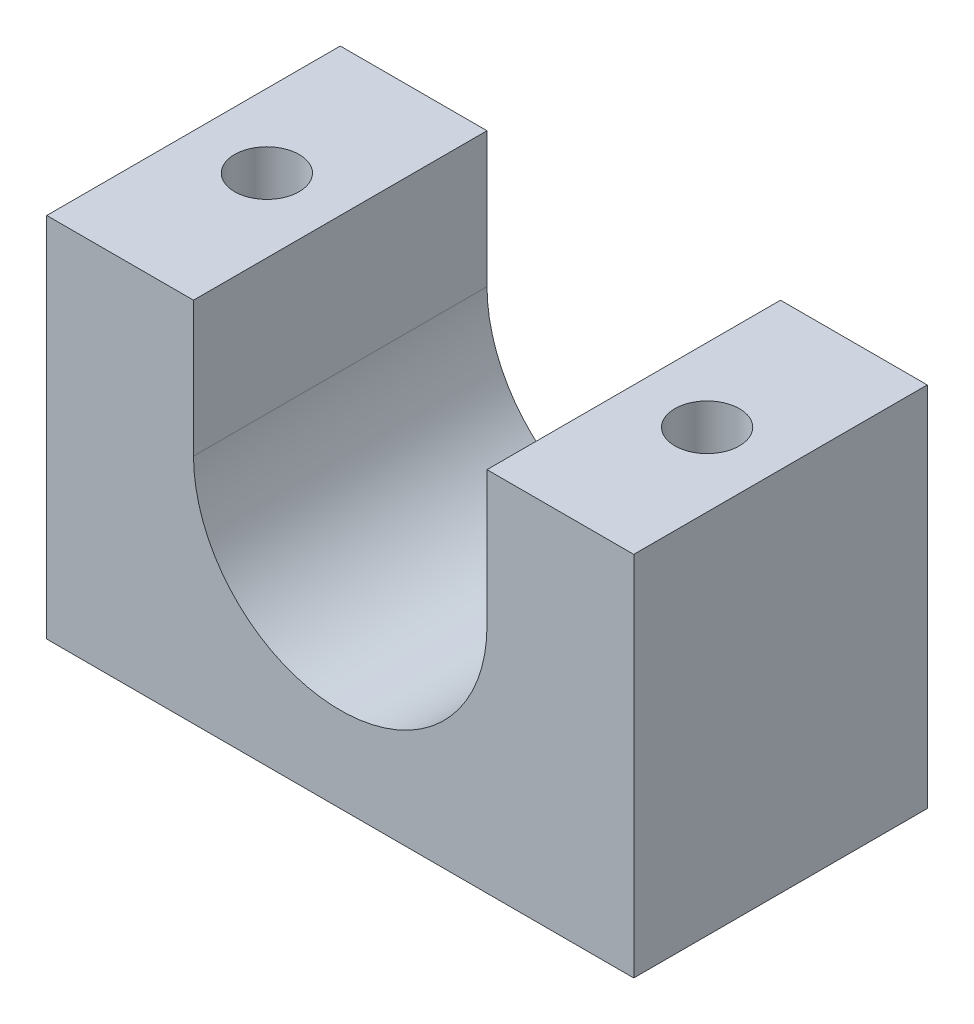
ISO-10303-21;
HEADER;
FILE_DESCRIPTION(('STEP AP214'),'2;1');
FILE_NAME('part.step','',(''),(''),'','','');
FILE_SCHEMA(('AUTOMOTIVE_DESIGN { 1 0 10303 214 1 1 1 1 }'));
ENDSEC;
DATA;
#1=APPLICATION_CONTEXT('core data for automotive mechanical design processes');
#2=APPLICATION_PROTOCOL_DEFINITION('international standard','automotive_design',2000,#1);
#3=PRODUCT_CONTEXT('',#1,'mechanical');
#4=PRODUCT('Part','Part','',(#3));
#5=PRODUCT_RELATED_PRODUCT_CATEGORY('part','',(#4));
#6=PRODUCT_DEFINITION_FORMATION('','',#4);
#7=PRODUCT_DEFINITION_CONTEXT('part definition',#1,'design');
#8=PRODUCT_DEFINITION('design','',#6,#7);
#9=PRODUCT_DEFINITION_SHAPE('','',#8);
#10=(LENGTH_UNIT() NAMED_UNIT(*) SI_UNIT(.MILLI.,.METRE.));
#11=(NAMED_UNIT(*) PLANE_ANGLE_UNIT() SI_UNIT($,.RADIAN.));
#12=(NAMED_UNIT(*) SI_UNIT($,.STERADIAN.) SOLID_ANGLE_UNIT());
#13=UNCERTAINTY_MEASURE_WITH_UNIT(LENGTH_MEASURE(1.E-05),#10,'distance_accuracy_value','');
#14=(GEOMETRIC_REPRESENTATION_CONTEXT(3) GLOBAL_UNCERTAINTY_ASSIGNED_CONTEXT((#13)) GLOBAL_UNIT_ASSIGNED_CONTEXT((#10,
#11,#12)) REPRESENTATION_CONTEXT('',''));
#15=CARTESIAN_POINT('',(0.,0.,0.));
#16=DIRECTION('',(0.,0.,1.));
#17=DIRECTION('',(1.,0.,0.));
#18=AXIS2_PLACEMENT_3D('',#15,#16,#17);
#19=CARTESIAN_POINT('',(20.,9.2,0.));
#20=DIRECTION('',(0.,1.,0.));
#21=DIRECTION('',(-1.,0.,0.));
#22=AXIS2_PLACEMENT_3D('',#19,#20,#21);
#23=PLANE('',#22);
#24=CARTESIAN_POINT('',(-15.,9.2,10.));
#25=DIRECTION('',(0.,1.,0.));
#26=DIRECTION('',(0.,0.,1.));
#27=AXIS2_PLACEMENT_3D('',#24,#25,#26);
#28=CIRCLE('',#27,2.20000000000001);
#29=CARTESIAN_POINT('',(-15.,9.2,12.2));
#30=VERTEX_POINT('',#29);
#31=EDGE_CURVE('E179',#30,#30,#28,.T.);
#32=ORIENTED_EDGE('',*,*,#31,.F.);
#33=EDGE_LOOP('',(#32));
#34=FACE_BOUND('',#33,.T.);
#35=DIRECTION('',(0.,0.,-1.));
#36=VECTOR('',#35,1.);
#37=CARTESIAN_POINT('',(-10.,9.2,20.));
#38=LINE('',#37,#36);
#39=CARTESIAN_POINT('',(-10.,9.2,20.));
#40=VERTEX_POINT('',#39);
#41=CARTESIAN_POINT('',(-10.,9.2,0.));
#42=VERTEX_POINT('',#41);
#43=EDGE_CURVE('E103',#40,#42,#38,.T.);
#44=ORIENTED_EDGE('',*,*,#43,.T.);
#45=DIRECTION('',(-1.,0.,0.));
#46=VECTOR('',#45,1.);
#47=CARTESIAN_POINT('',(20.,9.2,0.));
#48=LINE('',#47,#46);
#49=CARTESIAN_POINT('',(-20.,9.2,0.));
#50=VERTEX_POINT('',#49);
#51=EDGE_CURVE('E143',#42,#50,#48,.T.);
#52=ORIENTED_EDGE('',*,*,#51,.T.);
#53=DIRECTION('',(0.,0.,1.));
#54=VECTOR('',#53,1.);
#55=CARTESIAN_POINT('',(-20.,9.2,0.));
#56=LINE('',#55,#54);
#57=CARTESIAN_POINT('',(-20.,9.2,20.));
#58=VERTEX_POINT('',#57);
#59=EDGE_CURVE('E39',#50,#58,#56,.T.);
#60=ORIENTED_EDGE('',*,*,#59,.T.);
#61=DIRECTION('',(-1.,0.,0.));
#62=VECTOR('',#61,1.);
#63=CARTESIAN_POINT('',(20.,9.2,20.));
#64=LINE('',#63,#62);
#65=EDGE_CURVE('E117',#40,#58,#64,.T.);
#66=ORIENTED_EDGE('',*,*,#65,.F.);
#67=EDGE_LOOP('',(#44,#52,#60,#66));
#68=FACE_BOUND('',#67,.T.);
#69=ADVANCED_FACE('F30',(#34,#68),#23,.T.);
#70=CARTESIAN_POINT('',(-20.,-15.8,0.));
#71=DIRECTION('',(0.,-1.,0.));
#72=DIRECTION('',(1.,0.,0.));
#73=AXIS2_PLACEMENT_3D('',#70,#71,#72);
#74=PLANE('',#73);
#75=CARTESIAN_POINT('',(15.,-15.8,10.));
#76=DIRECTION('',(0.,1.,0.));
#77=DIRECTION('',(0.,0.,1.));
#78=AXIS2_PLACEMENT_3D('',#75,#76,#77);
#79=CIRCLE('',#78,2.20000000000001);
#80=CARTESIAN_POINT('',(15.,-15.8,12.2));
#81=VERTEX_POINT('',#80);
#82=EDGE_CURVE('E174',#81,#81,#79,.T.);
#83=ORIENTED_EDGE('',*,*,#82,.T.);
#84=EDGE_LOOP('',(#83));
#85=FACE_BOUND('',#84,.T.);
#86=CARTESIAN_POINT('',(-15.,-15.8,10.));
#87=DIRECTION('',(0.,1.,0.));
#88=DIRECTION('',(0.,0.,1.));
#89=AXIS2_PLACEMENT_3D('',#86,#87,#88);
#90=CIRCLE('',#89,2.20000000000001);
#91=CARTESIAN_POINT('',(-15.,-15.8,12.2));
#92=VERTEX_POINT('',#91);
#93=EDGE_CURVE('E177',#92,#92,#90,.T.);
#94=ORIENTED_EDGE('',*,*,#93,.T.);
#95=EDGE_LOOP('',(#94));
#96=FACE_BOUND('',#95,.T.);
#97=DIRECTION('',(1.,0.,0.));
#98=VECTOR('',#97,1.);
#99=CARTESIAN_POINT('',(-20.,-15.8,20.));
#100=LINE('',#99,#98);
#101=CARTESIAN_POINT('',(-20.,-15.8,20.));
#102=VERTEX_POINT('',#101);
#103=CARTESIAN_POINT('',(20.,-15.8,20.));
#104=VERTEX_POINT('',#103);
#105=EDGE_CURVE('E130',#102,#104,#100,.T.);
#106=ORIENTED_EDGE('',*,*,#105,.F.);
#107=DIRECTION('',(0.,0.,1.));
#108=VECTOR('',#107,1.);
#109=CARTESIAN_POINT('',(-20.,-15.8,0.));
#110=LINE('',#109,#108);
#111=CARTESIAN_POINT('',(-20.,-15.8,0.));
#112=VERTEX_POINT('',#111);
#113=EDGE_CURVE('E11',#112,#102,#110,.T.);
#114=ORIENTED_EDGE('',*,*,#113,.F.);
#115=DIRECTION('',(1.,0.,0.));
#116=VECTOR('',#115,1.);
#117=CARTESIAN_POINT('',(-20.,-15.8,0.));
#118=LINE('',#117,#116);
#119=CARTESIAN_POINT('',(20.,-15.8,0.));
#120=VERTEX_POINT('',#119);
#121=EDGE_CURVE('E134',#112,#120,#118,.T.);
#122=ORIENTED_EDGE('',*,*,#121,.T.);
#123=DIRECTION('',(0.,0.,1.));
#124=VECTOR('',#123,1.);
#125=CARTESIAN_POINT('',(20.,-15.8,0.));
#126=LINE('',#125,#124);
#127=EDGE_CURVE('E34',#120,#104,#126,.T.);
#128=ORIENTED_EDGE('',*,*,#127,.T.);
#129=EDGE_LOOP('',(#106,#114,#122,#128));
#130=FACE_BOUND('',#129,.T.);
#131=ADVANCED_FACE('F32',(#85,#96,#130),#74,.T.);
#132=CARTESIAN_POINT('',(-20.,9.2,0.));
#133=DIRECTION('',(-1.,0.,0.));
#134=DIRECTION('',(0.,0.,1.));
#135=AXIS2_PLACEMENT_3D('',#132,#133,#134);
#136=PLANE('',#135);
#137=DIRECTION('',(0.,-1.,0.));
#138=VECTOR('',#137,1.);
#139=CARTESIAN_POINT('',(-20.,9.2,20.));
#140=LINE('',#139,#138);
#141=EDGE_CURVE('E128',#58,#102,#140,.T.);
#142=ORIENTED_EDGE('',*,*,#141,.F.);
#143=ORIENTED_EDGE('',*,*,#59,.F.);
#144=DIRECTION('',(0.,-1.,0.));
#145=VECTOR('',#144,1.);
#146=CARTESIAN_POINT('',(-20.,9.2,0.));
#147=LINE('',#146,#145);
#148=EDGE_CURVE('E138',#50,#112,#147,.T.);
#149=ORIENTED_EDGE('',*,*,#148,.T.);
#150=ORIENTED_EDGE('',*,*,#113,.T.);
#151=EDGE_LOOP('',(#142,#143,#149,#150));
#152=FACE_BOUND('',#151,.T.);
#153=ADVANCED_FACE('F158',(#152),#136,.T.);
#154=CARTESIAN_POINT('',(15.,9.2,10.));
#155=DIRECTION('',(0.,1.,0.));
#156=DIRECTION('',(0.,0.,1.));
#157=AXIS2_PLACEMENT_3D('',#154,#155,#156);
#158=CIRCLE('',#157,2.20000000000001);
#159=CARTESIAN_POINT('',(15.,9.2,12.2));
#160=VERTEX_POINT('',#159);
#161=EDGE_CURVE('E224',#160,#160,#158,.T.);
#162=ORIENTED_EDGE('',*,*,#161,.F.);
#163=EDGE_LOOP('',(#162));
#164=FACE_BOUND('',#163,.T.);
#165=DIRECTION('',(0.,0.,-1.));
#166=VECTOR('',#165,1.);
#167=CARTESIAN_POINT('',(10.,9.2,20.));
#168=LINE('',#167,#166);
#169=CARTESIAN_POINT('',(10.,9.2,20.));
#170=VERTEX_POINT('',#169);
#171=CARTESIAN_POINT('',(10.,9.2,0.));
#172=VERTEX_POINT('',#171);
#173=EDGE_CURVE('E112',#170,#172,#168,.T.);
#174=ORIENTED_EDGE('',*,*,#173,.F.);
#175=CARTESIAN_POINT('',(20.,9.2,20.));
#176=VERTEX_POINT('',#175);
#177=EDGE_CURVE('E124',#176,#170,#64,.T.);
#178=ORIENTED_EDGE('',*,*,#177,.F.);
#179=DIRECTION('',(0.,0.,1.));
#180=VECTOR('',#179,1.);
#181=CARTESIAN_POINT('',(20.,9.2,0.));
#182=LINE('',#181,#180);
#183=CARTESIAN_POINT('',(20.,9.2,0.));
#184=VERTEX_POINT('',#183);
#185=EDGE_CURVE('E136',#184,#176,#182,.T.);
#186=ORIENTED_EDGE('',*,*,#185,.F.);
#187=EDGE_CURVE('E139',#184,#172,#48,.T.);
#188=ORIENTED_EDGE('',*,*,#187,.T.);
#189=EDGE_LOOP('',(#174,#178,#186,#188));
#190=FACE_BOUND('',#189,.T.);
#191=ADVANCED_FACE('F167',(#164,#190),#23,.T.);
#192=CARTESIAN_POINT('',(20.,-15.8,0.));
#193=DIRECTION('',(1.,0.,0.));
#194=DIRECTION('',(0.,1.,0.));
#195=AXIS2_PLACEMENT_3D('',#192,#193,#194);
#196=PLANE('',#195);
#197=DIRECTION('',(0.,1.,0.));
#198=VECTOR('',#197,1.);
#199=CARTESIAN_POINT('',(20.,-15.8,20.));
#200=LINE('',#199,#198);
#201=EDGE_CURVE('E125',#104,#176,#200,.T.);
#202=ORIENTED_EDGE('',*,*,#201,.F.);
#203=ORIENTED_EDGE('',*,*,#127,.F.);
#204=DIRECTION('',(0.,1.,0.));
#205=VECTOR('',#204,1.);
#206=CARTESIAN_POINT('',(20.,-15.8,0.));
#207=LINE('',#206,#205);
#208=EDGE_CURVE('E156',#120,#184,#207,.T.);
#209=ORIENTED_EDGE('',*,*,#208,.T.);
#210=ORIENTED_EDGE('',*,*,#185,.T.);
#211=EDGE_LOOP('',(#202,#203,#209,#210));
#212=FACE_BOUND('',#211,.T.);
#213=ADVANCED_FACE('F195',(#212),#196,.T.);
#214=CARTESIAN_POINT('',(20.,-15.8,0.));
#215=DIRECTION('',(0.,0.,1.));
#216=DIRECTION('',(1.,0.,0.));
#217=AXIS2_PLACEMENT_3D('',#214,#215,#216);
#218=PLANE('',#217);
#219=ORIENTED_EDGE('',*,*,#51,.F.);
#220=DIRECTION('',(0.,1.,0.));
#221=VECTOR('',#220,1.);
#222=CARTESIAN_POINT('',(-10.,0.,0.));
#223=LINE('',#222,#221);
#224=CARTESIAN_POINT('',(-10.,0.,0.));
#225=VERTEX_POINT('',#224);
#226=EDGE_CURVE('E108',#225,#42,#223,.T.);
#227=ORIENTED_EDGE('',*,*,#226,.F.);
#228=CARTESIAN_POINT('',(0.,0.,0.));
#229=DIRECTION('',(0.,0.,-1.));
#230=DIRECTION('',(-1.,0.,0.));
#231=AXIS2_PLACEMENT_3D('',#228,#229,#230);
#232=CIRCLE('',#231,10.);
#233=CARTESIAN_POINT('',(10.,0.,0.));
#234=VERTEX_POINT('',#233);
#235=EDGE_CURVE('E121',#234,#225,#232,.T.);
#236=ORIENTED_EDGE('',*,*,#235,.F.);
#237=DIRECTION('',(0.,-1.,0.));
#238=VECTOR('',#237,1.);
#239=CARTESIAN_POINT('',(10.,9.2,0.));
#240=LINE('',#239,#238);
#241=EDGE_CURVE('E181',#172,#234,#240,.T.);
#242=ORIENTED_EDGE('',*,*,#241,.F.);
#243=ORIENTED_EDGE('',*,*,#187,.F.);
#244=ORIENTED_EDGE('',*,*,#208,.F.);
#245=ORIENTED_EDGE('',*,*,#121,.F.);
#246=ORIENTED_EDGE('',*,*,#148,.F.);
#247=EDGE_LOOP('',(#219,#227,#236,#242,#243,#244,#245,#246));
#248=FACE_BOUND('',#247,.T.);
#249=ADVANCED_FACE('F159',(#248),#218,.F.);
#250=CARTESIAN_POINT('',(20.,-15.8,20.));
#251=DIRECTION('',(0.,0.,1.));
#252=DIRECTION('',(1.,0.,0.));
#253=AXIS2_PLACEMENT_3D('',#250,#251,#252);
#254=PLANE('',#253);
#255=DIRECTION('',(0.,1.,0.));
#256=VECTOR('',#255,1.);
#257=CARTESIAN_POINT('',(-10.,0.,20.));
#258=LINE('',#257,#256);
#259=CARTESIAN_POINT('',(-10.,0.,20.));
#260=VERTEX_POINT('',#259);
#261=EDGE_CURVE('E106',#260,#40,#258,.T.);
#262=ORIENTED_EDGE('',*,*,#261,.T.);
#263=ORIENTED_EDGE('',*,*,#65,.T.);
#264=ORIENTED_EDGE('',*,*,#141,.T.);
#265=ORIENTED_EDGE('',*,*,#105,.T.);
#266=ORIENTED_EDGE('',*,*,#201,.T.);
#267=ORIENTED_EDGE('',*,*,#177,.T.);
#268=DIRECTION('',(0.,-1.,0.));
#269=VECTOR('',#268,1.);
#270=CARTESIAN_POINT('',(10.,9.2,20.));
#271=LINE('',#270,#269);
#272=CARTESIAN_POINT('',(10.,0.,20.));
#273=VERTEX_POINT('',#272);
#274=EDGE_CURVE('E120',#170,#273,#271,.T.);
#275=ORIENTED_EDGE('',*,*,#274,.T.);
#276=CARTESIAN_POINT('',(0.,0.,20.));
#277=DIRECTION('',(0.,0.,-1.));
#278=DIRECTION('',(-1.,0.,0.));
#279=AXIS2_PLACEMENT_3D('',#276,#277,#278);
#280=CIRCLE('',#279,10.);
#281=EDGE_CURVE('E47',#273,#260,#280,.T.);
#282=ORIENTED_EDGE('',*,*,#281,.T.);
#283=EDGE_LOOP('',(#262,#263,#264,#265,#266,#267,#275,#282));
#284=FACE_BOUND('',#283,.T.);
#285=ADVANCED_FACE('F115',(#284),#254,.T.);
#286=CARTESIAN_POINT('',(-10.,0.,20.));
#287=DIRECTION('',(-1.,0.,0.));
#288=DIRECTION('',(0.,0.,1.));
#289=AXIS2_PLACEMENT_3D('',#286,#287,#288);
#290=PLANE('',#289);
#291=ORIENTED_EDGE('',*,*,#226,.T.);
#292=ORIENTED_EDGE('',*,*,#43,.F.);
#293=ORIENTED_EDGE('',*,*,#261,.F.);
#294=DIRECTION('',(0.,0.,-1.));
#295=VECTOR('',#294,1.);
#296=CARTESIAN_POINT('',(-10.,0.,20.));
#297=LINE('',#296,#295);
#298=EDGE_CURVE('E147',#260,#225,#297,.T.);
#299=ORIENTED_EDGE('',*,*,#298,.T.);
#300=EDGE_LOOP('',(#291,#292,#293,#299));
#301=FACE_BOUND('',#300,.T.);
#302=ADVANCED_FACE('F105',(#301),#290,.F.);
#303=CARTESIAN_POINT('',(0.,0.,20.));
#304=DIRECTION('',(0.,0.,-1.));
#305=DIRECTION('',(-1.,0.,0.));
#306=AXIS2_PLACEMENT_3D('',#303,#304,#305);
#307=CYLINDRICAL_SURFACE('',#306,10.);
#308=ORIENTED_EDGE('',*,*,#235,.T.);
#309=ORIENTED_EDGE('',*,*,#298,.F.);
#310=ORIENTED_EDGE('',*,*,#281,.F.);
#311=DIRECTION('',(0.,0.,-1.));
#312=VECTOR('',#311,1.);
#313=CARTESIAN_POINT('',(10.,0.,20.));
#314=LINE('',#313,#312);
#315=EDGE_CURVE('E148',#273,#234,#314,.T.);
#316=ORIENTED_EDGE('',*,*,#315,.T.);
#317=EDGE_LOOP('',(#308,#309,#310,#316));
#318=FACE_BOUND('',#317,.T.);
#319=ADVANCED_FACE('F192',(#318),#307,.F.);
#320=CARTESIAN_POINT('',(10.,9.2,20.));
#321=DIRECTION('',(1.,0.,0.));
#322=DIRECTION('',(0.,1.,0.));
#323=AXIS2_PLACEMENT_3D('',#320,#321,#322);
#324=PLANE('',#323);
#325=ORIENTED_EDGE('',*,*,#241,.T.);
#326=ORIENTED_EDGE('',*,*,#315,.F.);
#327=ORIENTED_EDGE('',*,*,#274,.F.);
#328=ORIENTED_EDGE('',*,*,#173,.T.);
#329=EDGE_LOOP('',(#325,#326,#327,#328));
#330=FACE_BOUND('',#329,.T.);
#331=ADVANCED_FACE('F208',(#330),#324,.F.);
#332=CARTESIAN_POINT('',(-15.,9.2,10.));
#333=DIRECTION('',(0.,1.,0.));
#334=DIRECTION('',(0.,0.,1.));
#335=AXIS2_PLACEMENT_3D('',#332,#333,#334);
#336=CYLINDRICAL_SURFACE('',#335,2.20000000000001);
#337=ORIENTED_EDGE('',*,*,#93,.F.);
#338=EDGE_LOOP('',(#337));
#339=FACE_BOUND('',#338,.T.);
#340=ORIENTED_EDGE('',*,*,#31,.T.);
#341=EDGE_LOOP('',(#340));
#342=FACE_BOUND('',#341,.T.);
#343=ADVANCED_FACE('F211',(#339,#342),#336,.F.);
#344=CARTESIAN_POINT('',(15.,9.2,10.));
#345=DIRECTION('',(0.,1.,0.));
#346=DIRECTION('',(0.,0.,1.));
#347=AXIS2_PLACEMENT_3D('',#344,#345,#346);
#348=CYLINDRICAL_SURFACE('',#347,2.20000000000001);
#349=ORIENTED_EDGE('',*,*,#82,.F.);
#350=EDGE_LOOP('',(#349));
#351=FACE_BOUND('',#350,.T.);
#352=ORIENTED_EDGE('',*,*,#161,.T.);
#353=EDGE_LOOP('',(#352));
#354=FACE_BOUND('',#353,.T.);
#355=ADVANCED_FACE('F216',(#351,#354),#348,.F.);
#356=CLOSED_SHELL('',(#69,#131,#153,#191,#213,#249,#285,#302,#319,#331,#343,#355));
#357=MANIFOLD_SOLID_BREP('B2',#356);
#358=ADVANCED_BREP_SHAPE_REPRESENTATION('',(#18,#357),#14);
#359=SHAPE_DEFINITION_REPRESENTATION(#9,#358);
ENDSEC;
END-ISO-10303-21;
